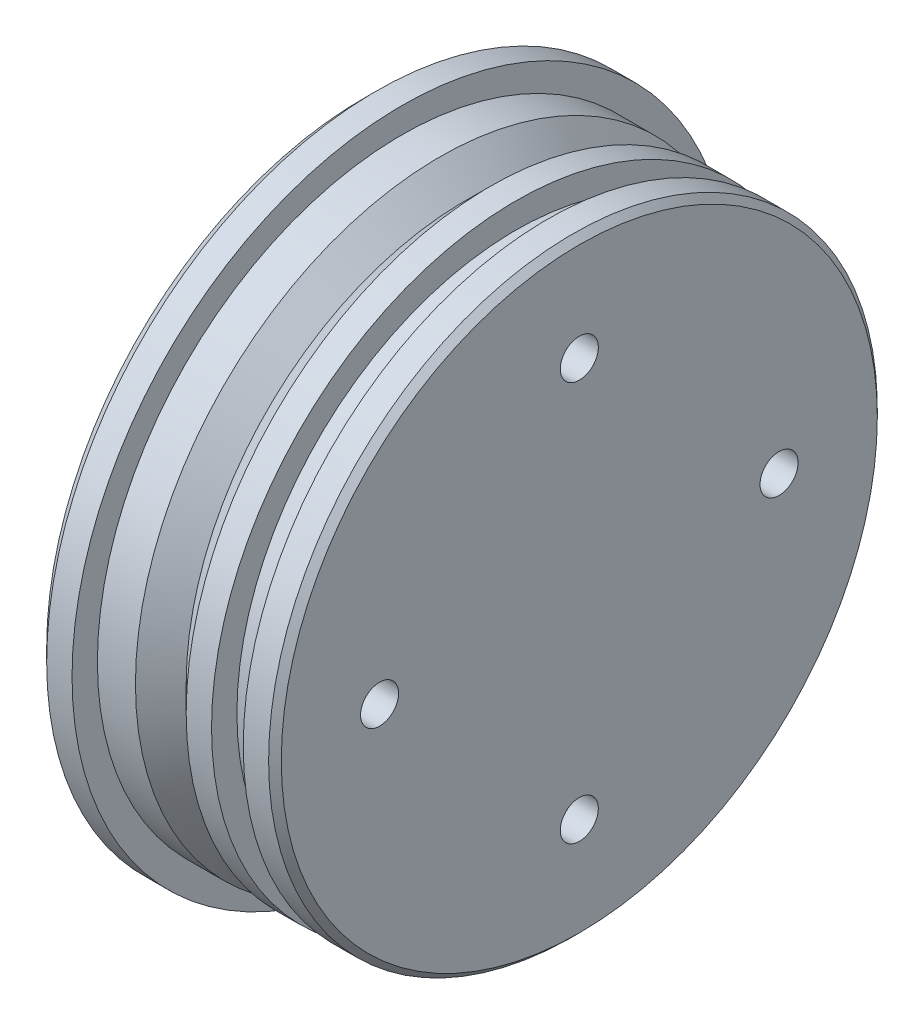
ISO-10303-21;
HEADER;
FILE_DESCRIPTION(('STEP AP214'),'2;1');
FILE_NAME('part.step','',(''),(''),'','','');
FILE_SCHEMA(('AUTOMOTIVE_DESIGN { 1 0 10303 214 1 1 1 1 }'));
ENDSEC;
DATA;
#1=APPLICATION_CONTEXT('core data for automotive mechanical design processes');
#2=APPLICATION_PROTOCOL_DEFINITION('international standard','automotive_design',2000,#1);
#3=PRODUCT_CONTEXT('',#1,'mechanical');
#4=PRODUCT('Part','Part','',(#3));
#5=PRODUCT_RELATED_PRODUCT_CATEGORY('part','',(#4));
#6=PRODUCT_DEFINITION_FORMATION('','',#4);
#7=PRODUCT_DEFINITION_CONTEXT('part definition',#1,'design');
#8=PRODUCT_DEFINITION('design','',#6,#7);
#9=PRODUCT_DEFINITION_SHAPE('','',#8);
#10=(LENGTH_UNIT() NAMED_UNIT(*) SI_UNIT(.MILLI.,.METRE.));
#11=(NAMED_UNIT(*) PLANE_ANGLE_UNIT() SI_UNIT($,.RADIAN.));
#12=(NAMED_UNIT(*) SI_UNIT($,.STERADIAN.) SOLID_ANGLE_UNIT());
#13=UNCERTAINTY_MEASURE_WITH_UNIT(LENGTH_MEASURE(1.E-05),#10,'distance_accuracy_value','');
#14=(GEOMETRIC_REPRESENTATION_CONTEXT(3) GLOBAL_UNCERTAINTY_ASSIGNED_CONTEXT((#13)) GLOBAL_UNIT_ASSIGNED_CONTEXT((#10,
#11,#12)) REPRESENTATION_CONTEXT('',''));
#15=CARTESIAN_POINT('',(0.,0.,0.));
#16=DIRECTION('',(0.,0.,1.));
#17=DIRECTION('',(1.,0.,0.));
#18=AXIS2_PLACEMENT_3D('',#15,#16,#17);
#19=CARTESIAN_POINT('',(-17.,0.,0.));
#20=DIRECTION('',(1.,0.,0.));
#21=DIRECTION('',(0.,0.,-1.));
#22=AXIS2_PLACEMENT_3D('',#19,#20,#21);
#23=PLANE('',#22);
#24=CARTESIAN_POINT('',(-17.,0.,0.));
#25=DIRECTION('',(-1.,0.,0.));
#26=DIRECTION('',(0.,0.,1.));
#27=AXIS2_PLACEMENT_3D('',#24,#25,#26);
#28=CIRCLE('',#27,25.);
#29=CARTESIAN_POINT('',(-17.,0.,25.));
#30=VERTEX_POINT('',#29);
#31=EDGE_CURVE('E10',#30,#30,#28,.T.);
#32=ORIENTED_EDGE('',*,*,#31,.T.);
#33=EDGE_LOOP('',(#32));
#34=FACE_BOUND('',#33,.T.);
#35=ADVANCED_FACE('F35',(#34),#23,.F.);
#36=CARTESIAN_POINT('',(-16.,0.,0.));
#37=DIRECTION('',(1.,0.,0.));
#38=DIRECTION('',(0.,0.,-1.));
#39=AXIS2_PLACEMENT_3D('',#36,#37,#38);
#40=CONICAL_SURFACE('',#39,26.,0.78539816339745);
#41=ORIENTED_EDGE('',*,*,#31,.F.);
#42=EDGE_LOOP('',(#41));
#43=FACE_BOUND('',#42,.T.);
#44=CARTESIAN_POINT('',(-16.,0.,0.));
#45=DIRECTION('',(-1.,0.,0.));
#46=DIRECTION('',(0.,0.,1.));
#47=AXIS2_PLACEMENT_3D('',#44,#45,#46);
#48=CIRCLE('',#47,26.);
#49=CARTESIAN_POINT('',(-16.,0.,26.));
#50=VERTEX_POINT('',#49);
#51=EDGE_CURVE('E41',#50,#50,#48,.T.);
#52=ORIENTED_EDGE('',*,*,#51,.T.);
#53=EDGE_LOOP('',(#52));
#54=FACE_BOUND('',#53,.T.);
#55=ADVANCED_FACE('F141',(#43,#54),#40,.T.);
#56=CARTESIAN_POINT('',(0.,0.,0.));
#57=DIRECTION('',(-1.,0.,0.));
#58=DIRECTION('',(0.,0.,1.));
#59=AXIS2_PLACEMENT_3D('',#56,#57,#58);
#60=CYLINDRICAL_SURFACE('',#59,26.);
#61=ORIENTED_EDGE('',*,*,#51,.F.);
#62=EDGE_LOOP('',(#61));
#63=FACE_BOUND('',#62,.T.);
#64=CARTESIAN_POINT('',(-14.,0.,0.));
#65=DIRECTION('',(-1.,0.,0.));
#66=DIRECTION('',(0.,0.,1.));
#67=AXIS2_PLACEMENT_3D('',#64,#65,#66);
#68=CIRCLE('',#67,26.);
#69=CARTESIAN_POINT('',(-14.,0.,26.));
#70=VERTEX_POINT('',#69);
#71=EDGE_CURVE('E45',#70,#70,#68,.T.);
#72=ORIENTED_EDGE('',*,*,#71,.T.);
#73=EDGE_LOOP('',(#72));
#74=FACE_BOUND('',#73,.T.);
#75=ADVANCED_FACE('F145',(#63,#74),#60,.T.);
#76=CARTESIAN_POINT('',(-14.,26.,0.));
#77=DIRECTION('',(-1.,0.,0.));
#78=DIRECTION('',(0.,0.,1.));
#79=AXIS2_PLACEMENT_3D('',#76,#77,#78);
#80=PLANE('',#79);
#81=ORIENTED_EDGE('',*,*,#71,.F.);
#82=EDGE_LOOP('',(#81));
#83=FACE_BOUND('',#82,.T.);
#84=CARTESIAN_POINT('',(-14.,0.,0.));
#85=DIRECTION('',(-1.,0.,0.));
#86=DIRECTION('',(0.,0.,1.));
#87=AXIS2_PLACEMENT_3D('',#84,#85,#86);
#88=CIRCLE('',#87,24.);
#89=CARTESIAN_POINT('',(-14.,0.,24.));
#90=VERTEX_POINT('',#89);
#91=EDGE_CURVE('E49',#90,#90,#88,.T.);
#92=ORIENTED_EDGE('',*,*,#91,.T.);
#93=EDGE_LOOP('',(#92));
#94=FACE_BOUND('',#93,.T.);
#95=ADVANCED_FACE('F150',(#83,#94),#80,.F.);
#96=CARTESIAN_POINT('',(0.,0.,0.));
#97=DIRECTION('',(-1.,0.,0.));
#98=DIRECTION('',(0.,0.,1.));
#99=AXIS2_PLACEMENT_3D('',#96,#97,#98);
#100=CYLINDRICAL_SURFACE('',#99,24.);
#101=ORIENTED_EDGE('',*,*,#91,.F.);
#102=EDGE_LOOP('',(#101));
#103=FACE_BOUND('',#102,.T.);
#104=CARTESIAN_POINT('',(-11.,0.,0.));
#105=DIRECTION('',(-1.,0.,0.));
#106=DIRECTION('',(0.,0.,1.));
#107=AXIS2_PLACEMENT_3D('',#104,#105,#106);
#108=CIRCLE('',#107,24.);
#109=CARTESIAN_POINT('',(-11.,0.,24.));
#110=VERTEX_POINT('',#109);
#111=EDGE_CURVE('E54',#110,#110,#108,.T.);
#112=ORIENTED_EDGE('',*,*,#111,.T.);
#113=EDGE_LOOP('',(#112));
#114=FACE_BOUND('',#113,.T.);
#115=ADVANCED_FACE('F156',(#103,#114),#100,.T.);
#116=CARTESIAN_POINT('',(-9.00000000000002,0.,0.));
#117=DIRECTION('',(-1.,0.,0.));
#118=DIRECTION('',(0.,0.,1.));
#119=AXIS2_PLACEMENT_3D('',#116,#117,#118);
#120=CONICAL_SURFACE('',#119,22.,0.785398163397451);
#121=ORIENTED_EDGE('',*,*,#111,.F.);
#122=EDGE_LOOP('',(#121));
#123=FACE_BOUND('',#122,.T.);
#124=CARTESIAN_POINT('',(-9.00000000000002,0.,0.));
#125=DIRECTION('',(-1.,0.,0.));
#126=DIRECTION('',(0.,0.,1.));
#127=AXIS2_PLACEMENT_3D('',#124,#125,#126);
#128=CIRCLE('',#127,22.);
#129=CARTESIAN_POINT('',(-9.00000000000002,0.,22.));
#130=VERTEX_POINT('',#129);
#131=EDGE_CURVE('E57',#130,#130,#128,.T.);
#132=ORIENTED_EDGE('',*,*,#131,.T.);
#133=EDGE_LOOP('',(#132));
#134=FACE_BOUND('',#133,.T.);
#135=ADVANCED_FACE('F160',(#123,#134),#120,.T.);
#136=CARTESIAN_POINT('',(-7.00000000000001,0.,0.));
#137=DIRECTION('',(1.,0.,0.));
#138=DIRECTION('',(0.,0.,-1.));
#139=AXIS2_PLACEMENT_3D('',#136,#137,#138);
#140=CONICAL_SURFACE('',#139,24.,0.785398163397445);
#141=ORIENTED_EDGE('',*,*,#131,.F.);
#142=EDGE_LOOP('',(#141));
#143=FACE_BOUND('',#142,.T.);
#144=CARTESIAN_POINT('',(-7.00000000000001,0.,0.));
#145=DIRECTION('',(-1.,0.,0.));
#146=DIRECTION('',(0.,0.,1.));
#147=AXIS2_PLACEMENT_3D('',#144,#145,#146);
#148=CIRCLE('',#147,24.);
#149=CARTESIAN_POINT('',(-7.00000000000001,0.,24.));
#150=VERTEX_POINT('',#149);
#151=EDGE_CURVE('E60',#150,#150,#148,.T.);
#152=ORIENTED_EDGE('',*,*,#151,.T.);
#153=EDGE_LOOP('',(#152));
#154=FACE_BOUND('',#153,.T.);
#155=ADVANCED_FACE('F164',(#143,#154),#140,.T.);
#156=CARTESIAN_POINT('',(0.,0.,0.));
#157=DIRECTION('',(-1.,0.,0.));
#158=DIRECTION('',(0.,0.,1.));
#159=AXIS2_PLACEMENT_3D('',#156,#157,#158);
#160=CYLINDRICAL_SURFACE('',#159,24.);
#161=ORIENTED_EDGE('',*,*,#151,.F.);
#162=EDGE_LOOP('',(#161));
#163=FACE_BOUND('',#162,.T.);
#164=CARTESIAN_POINT('',(-5.00000000000001,0.,0.));
#165=DIRECTION('',(-1.,0.,0.));
#166=DIRECTION('',(0.,0.,1.));
#167=AXIS2_PLACEMENT_3D('',#164,#165,#166);
#168=CIRCLE('',#167,24.);
#169=CARTESIAN_POINT('',(-5.00000000000001,0.,24.));
#170=VERTEX_POINT('',#169);
#171=EDGE_CURVE('E63',#170,#170,#168,.T.);
#172=ORIENTED_EDGE('',*,*,#171,.T.);
#173=EDGE_LOOP('',(#172));
#174=FACE_BOUND('',#173,.T.);
#175=ADVANCED_FACE('F168',(#163,#174),#160,.T.);
#176=CARTESIAN_POINT('',(-5.00000000000001,24.,0.));
#177=DIRECTION('',(-1.,0.,0.));
#178=DIRECTION('',(0.,0.,1.));
#179=AXIS2_PLACEMENT_3D('',#176,#177,#178);
#180=PLANE('',#179);
#181=ORIENTED_EDGE('',*,*,#171,.F.);
#182=EDGE_LOOP('',(#181));
#183=FACE_BOUND('',#182,.T.);
#184=CARTESIAN_POINT('',(-5.00000000000001,0.,0.));
#185=DIRECTION('',(-1.,0.,0.));
#186=DIRECTION('',(0.,0.,1.));
#187=AXIS2_PLACEMENT_3D('',#184,#185,#186);
#188=CIRCLE('',#187,22.);
#189=CARTESIAN_POINT('',(-5.00000000000001,0.,22.));
#190=VERTEX_POINT('',#189);
#191=EDGE_CURVE('E66',#190,#190,#188,.T.);
#192=ORIENTED_EDGE('',*,*,#191,.T.);
#193=EDGE_LOOP('',(#192));
#194=FACE_BOUND('',#193,.T.);
#195=ADVANCED_FACE('F172',(#183,#194),#180,.F.);
#196=CARTESIAN_POINT('',(0.,0.,0.));
#197=DIRECTION('',(-1.,0.,0.));
#198=DIRECTION('',(0.,0.,1.));
#199=AXIS2_PLACEMENT_3D('',#196,#197,#198);
#200=CYLINDRICAL_SURFACE('',#199,22.);
#201=ORIENTED_EDGE('',*,*,#191,.F.);
#202=EDGE_LOOP('',(#201));
#203=FACE_BOUND('',#202,.T.);
#204=CARTESIAN_POINT('',(-2.50000000000001,0.,0.));
#205=DIRECTION('',(-1.,0.,0.));
#206=DIRECTION('',(0.,0.,1.));
#207=AXIS2_PLACEMENT_3D('',#204,#205,#206);
#208=CIRCLE('',#207,22.);
#209=CARTESIAN_POINT('',(-2.50000000000001,0.,22.));
#210=VERTEX_POINT('',#209);
#211=EDGE_CURVE('E69',#210,#210,#208,.T.);
#212=ORIENTED_EDGE('',*,*,#211,.T.);
#213=EDGE_LOOP('',(#212));
#214=FACE_BOUND('',#213,.T.);
#215=ADVANCED_FACE('F176',(#203,#214),#200,.T.);
#216=CARTESIAN_POINT('',(-2.50000000000001,22.,0.));
#217=DIRECTION('',(1.,0.,0.));
#218=DIRECTION('',(0.,0.,-1.));
#219=AXIS2_PLACEMENT_3D('',#216,#217,#218);
#220=PLANE('',#219);
#221=ORIENTED_EDGE('',*,*,#211,.F.);
#222=EDGE_LOOP('',(#221));
#223=FACE_BOUND('',#222,.T.);
#224=CARTESIAN_POINT('',(-2.50000000000001,0.,0.));
#225=DIRECTION('',(-1.,0.,0.));
#226=DIRECTION('',(0.,0.,1.));
#227=AXIS2_PLACEMENT_3D('',#224,#225,#226);
#228=CIRCLE('',#227,24.);
#229=CARTESIAN_POINT('',(-2.50000000000001,0.,24.));
#230=VERTEX_POINT('',#229);
#231=EDGE_CURVE('E72',#230,#230,#228,.T.);
#232=ORIENTED_EDGE('',*,*,#231,.T.);
#233=EDGE_LOOP('',(#232));
#234=FACE_BOUND('',#233,.T.);
#235=ADVANCED_FACE('F136',(#223,#234),#220,.F.);
#236=CARTESIAN_POINT('',(0.,0.,0.));
#237=DIRECTION('',(-1.,0.,0.));
#238=DIRECTION('',(0.,0.,1.));
#239=AXIS2_PLACEMENT_3D('',#236,#237,#238);
#240=CYLINDRICAL_SURFACE('',#239,24.);
#241=ORIENTED_EDGE('',*,*,#231,.F.);
#242=EDGE_LOOP('',(#241));
#243=FACE_BOUND('',#242,.T.);
#244=CARTESIAN_POINT('',(-0.500000000000003,0.,0.));
#245=DIRECTION('',(-1.,0.,0.));
#246=DIRECTION('',(0.,0.,1.));
#247=AXIS2_PLACEMENT_3D('',#244,#245,#246);
#248=CIRCLE('',#247,24.);
#249=CARTESIAN_POINT('',(-0.500000000000003,0.,24.));
#250=VERTEX_POINT('',#249);
#251=EDGE_CURVE('E75',#250,#250,#248,.T.);
#252=ORIENTED_EDGE('',*,*,#251,.T.);
#253=EDGE_LOOP('',(#252));
#254=FACE_BOUND('',#253,.T.);
#255=ADVANCED_FACE('F130',(#243,#254),#240,.T.);
#256=CARTESIAN_POINT('',(0.,0.,0.));
#257=DIRECTION('',(-1.,0.,0.));
#258=DIRECTION('',(0.,0.,1.));
#259=AXIS2_PLACEMENT_3D('',#256,#257,#258);
#260=CONICAL_SURFACE('',#259,23.5,0.785398163397446);
#261=ORIENTED_EDGE('',*,*,#251,.F.);
#262=EDGE_LOOP('',(#261));
#263=FACE_BOUND('',#262,.T.);
#264=CARTESIAN_POINT('',(0.,0.,0.));
#265=DIRECTION('',(-1.,0.,0.));
#266=DIRECTION('',(0.,0.,1.));
#267=AXIS2_PLACEMENT_3D('',#264,#265,#266);
#268=CIRCLE('',#267,23.5);
#269=CARTESIAN_POINT('',(0.,0.,23.5));
#270=VERTEX_POINT('',#269);
#271=EDGE_CURVE('E78',#270,#270,#268,.T.);
#272=ORIENTED_EDGE('',*,*,#271,.T.);
#273=EDGE_LOOP('',(#272));
#274=FACE_BOUND('',#273,.T.);
#275=ADVANCED_FACE('F119',(#263,#274),#260,.T.);
#276=CARTESIAN_POINT('',(0.,23.5,0.));
#277=DIRECTION('',(-1.,0.,0.));
#278=DIRECTION('',(0.,0.,1.));
#279=AXIS2_PLACEMENT_3D('',#276,#277,#278);
#280=PLANE('',#279);
#281=CARTESIAN_POINT('',(0.,15.75,-2.78423117894278E-13));
#282=DIRECTION('',(1.,0.,0.));
#283=DIRECTION('',(0.,0.,-1.));
#284=AXIS2_PLACEMENT_3D('',#281,#282,#283);
#285=CIRCLE('',#284,1.5);
#286=CARTESIAN_POINT('',(0.,15.75,-1.50000000000028));
#287=VERTEX_POINT('',#286);
#288=EDGE_CURVE('E100',#287,#287,#285,.T.);
#289=ORIENTED_EDGE('',*,*,#288,.F.);
#290=EDGE_LOOP('',(#289));
#291=FACE_BOUND('',#290,.T.);
#292=CARTESIAN_POINT('',(0.,-1.10154940724527E-13,-15.75));
#293=DIRECTION('',(1.,0.,0.));
#294=DIRECTION('',(0.,0.,-1.));
#295=AXIS2_PLACEMENT_3D('',#292,#293,#294);
#296=CIRCLE('',#295,1.5);
#297=CARTESIAN_POINT('',(0.,-1.10154940724527E-13,-17.25));
#298=VERTEX_POINT('',#297);
#299=EDGE_CURVE('E97',#298,#298,#296,.T.);
#300=ORIENTED_EDGE('',*,*,#299,.F.);
#301=EDGE_LOOP('',(#300));
#302=FACE_BOUND('',#301,.T.);
#303=CARTESIAN_POINT('',(0.,0.,15.75));
#304=DIRECTION('',(1.,0.,0.));
#305=DIRECTION('',(0.,0.,-1.));
#306=AXIS2_PLACEMENT_3D('',#303,#304,#305);
#307=CIRCLE('',#306,1.5);
#308=CARTESIAN_POINT('',(0.,0.,14.25));
#309=VERTEX_POINT('',#308);
#310=EDGE_CURVE('E91',#309,#309,#307,.T.);
#311=ORIENTED_EDGE('',*,*,#310,.F.);
#312=EDGE_LOOP('',(#311));
#313=FACE_BOUND('',#312,.T.);
#314=CARTESIAN_POINT('',(0.,-15.75,1.63043674551681E-13));
#315=DIRECTION('',(1.,0.,0.));
#316=DIRECTION('',(0.,0.,-1.));
#317=AXIS2_PLACEMENT_3D('',#314,#315,#316);
#318=CIRCLE('',#317,1.5);
#319=CARTESIAN_POINT('',(0.,-15.75,-1.49999999999983));
#320=VERTEX_POINT('',#319);
#321=EDGE_CURVE('E85',#320,#320,#318,.T.);
#322=ORIENTED_EDGE('',*,*,#321,.F.);
#323=EDGE_LOOP('',(#322));
#324=FACE_BOUND('',#323,.T.);
#325=ORIENTED_EDGE('',*,*,#271,.F.);
#326=EDGE_LOOP('',(#325));
#327=FACE_BOUND('',#326,.T.);
#328=ADVANCED_FACE('F115',(#291,#302,#313,#324,#327),#280,.F.);
#329=CARTESIAN_POINT('',(-10.,-15.75,1.63043674551681E-13));
#330=DIRECTION('',(1.,0.,0.));
#331=DIRECTION('',(0.,0.,-1.));
#332=AXIS2_PLACEMENT_3D('',#329,#330,#331);
#333=CYLINDRICAL_SURFACE('',#332,1.5);
#334=CARTESIAN_POINT('',(-10.,-15.75,1.63043674551681E-13));
#335=DIRECTION('',(1.,0.,0.));
#336=DIRECTION('',(0.,0.,-1.));
#337=AXIS2_PLACEMENT_3D('',#334,#335,#336);
#338=CIRCLE('',#337,1.5);
#339=CARTESIAN_POINT('',(-10.,-15.75,-1.49999999999983));
#340=VERTEX_POINT('',#339);
#341=EDGE_CURVE('E82',#340,#340,#338,.T.);
#342=ORIENTED_EDGE('',*,*,#341,.F.);
#343=EDGE_LOOP('',(#342));
#344=FACE_BOUND('',#343,.T.);
#345=ORIENTED_EDGE('',*,*,#321,.T.);
#346=EDGE_LOOP('',(#345));
#347=FACE_BOUND('',#346,.T.);
#348=ADVANCED_FACE('F118',(#344,#347),#333,.F.);
#349=CARTESIAN_POINT('',(-10.,-15.75,1.63043674551681E-13));
#350=DIRECTION('',(1.,0.,0.));
#351=DIRECTION('',(0.,0.,-1.));
#352=AXIS2_PLACEMENT_3D('',#349,#350,#351);
#353=PLANE('',#352);
#354=ORIENTED_EDGE('',*,*,#341,.T.);
#355=EDGE_LOOP('',(#354));
#356=FACE_BOUND('',#355,.T.);
#357=ADVANCED_FACE('F215',(#356),#353,.T.);
#358=CARTESIAN_POINT('',(-10.,0.,15.75));
#359=DIRECTION('',(1.,0.,0.));
#360=DIRECTION('',(0.,0.,-1.));
#361=AXIS2_PLACEMENT_3D('',#358,#359,#360);
#362=CYLINDRICAL_SURFACE('',#361,1.5);
#363=CARTESIAN_POINT('',(-10.,0.,15.75));
#364=DIRECTION('',(1.,0.,0.));
#365=DIRECTION('',(0.,0.,-1.));
#366=AXIS2_PLACEMENT_3D('',#363,#364,#365);
#367=CIRCLE('',#366,1.5);
#368=CARTESIAN_POINT('',(-10.,0.,14.25));
#369=VERTEX_POINT('',#368);
#370=EDGE_CURVE('E88',#369,#369,#367,.T.);
#371=ORIENTED_EDGE('',*,*,#370,.F.);
#372=EDGE_LOOP('',(#371));
#373=FACE_BOUND('',#372,.T.);
#374=ORIENTED_EDGE('',*,*,#310,.T.);
#375=EDGE_LOOP('',(#374));
#376=FACE_BOUND('',#375,.T.);
#377=ADVANCED_FACE('F225',(#373,#376),#362,.F.);
#378=CARTESIAN_POINT('',(-10.,0.,15.75));
#379=DIRECTION('',(1.,0.,0.));
#380=DIRECTION('',(0.,0.,-1.));
#381=AXIS2_PLACEMENT_3D('',#378,#379,#380);
#382=PLANE('',#381);
#383=ORIENTED_EDGE('',*,*,#370,.T.);
#384=EDGE_LOOP('',(#383));
#385=FACE_BOUND('',#384,.T.);
#386=ADVANCED_FACE('F235',(#385),#382,.T.);
#387=CARTESIAN_POINT('',(-10.,-1.10154940724527E-13,-15.75));
#388=DIRECTION('',(1.,0.,0.));
#389=DIRECTION('',(0.,0.,-1.));
#390=AXIS2_PLACEMENT_3D('',#387,#388,#389);
#391=CYLINDRICAL_SURFACE('',#390,1.5);
#392=CARTESIAN_POINT('',(-10.,-1.10154940724527E-13,-15.75));
#393=DIRECTION('',(1.,0.,0.));
#394=DIRECTION('',(0.,0.,-1.));
#395=AXIS2_PLACEMENT_3D('',#392,#393,#394);
#396=CIRCLE('',#395,1.5);
#397=CARTESIAN_POINT('',(-10.,-1.10154940724527E-13,-17.25));
#398=VERTEX_POINT('',#397);
#399=EDGE_CURVE('E94',#398,#398,#396,.T.);
#400=ORIENTED_EDGE('',*,*,#399,.F.);
#401=EDGE_LOOP('',(#400));
#402=FACE_BOUND('',#401,.T.);
#403=ORIENTED_EDGE('',*,*,#299,.T.);
#404=EDGE_LOOP('',(#403));
#405=FACE_BOUND('',#404,.T.);
#406=ADVANCED_FACE('F245',(#402,#405),#391,.F.);
#407=CARTESIAN_POINT('',(-10.,0.,0.));
#408=DIRECTION('',(1.,0.,0.));
#409=DIRECTION('',(0.,0.,-1.));
#410=AXIS2_PLACEMENT_3D('',#407,#408,#409);
#411=PLANE('',#410);
#412=ORIENTED_EDGE('',*,*,#399,.T.);
#413=EDGE_LOOP('',(#412));
#414=FACE_BOUND('',#413,.T.);
#415=ADVANCED_FACE('F111',(#414),#411,.T.);
#416=CARTESIAN_POINT('',(-10.,15.75,-2.78423117894278E-13));
#417=DIRECTION('',(1.,0.,0.));
#418=DIRECTION('',(0.,0.,-1.));
#419=AXIS2_PLACEMENT_3D('',#416,#417,#418);
#420=CYLINDRICAL_SURFACE('',#419,1.5);
#421=CARTESIAN_POINT('',(-10.,15.75,-2.78423117894278E-13));
#422=DIRECTION('',(1.,0.,0.));
#423=DIRECTION('',(0.,0.,-1.));
#424=AXIS2_PLACEMENT_3D('',#421,#422,#423);
#425=CIRCLE('',#424,1.5);
#426=CARTESIAN_POINT('',(-10.,15.75,-1.50000000000028));
#427=VERTEX_POINT('',#426);
#428=EDGE_CURVE('E81',#427,#427,#425,.T.);
#429=ORIENTED_EDGE('',*,*,#428,.F.);
#430=EDGE_LOOP('',(#429));
#431=FACE_BOUND('',#430,.T.);
#432=ORIENTED_EDGE('',*,*,#288,.T.);
#433=EDGE_LOOP('',(#432));
#434=FACE_BOUND('',#433,.T.);
#435=ADVANCED_FACE('F108',(#431,#434),#420,.F.);
#436=CARTESIAN_POINT('',(-10.,0.,0.));
#437=DIRECTION('',(1.,0.,0.));
#438=DIRECTION('',(0.,0.,-1.));
#439=AXIS2_PLACEMENT_3D('',#436,#437,#438);
#440=PLANE('',#439);
#441=ORIENTED_EDGE('',*,*,#428,.T.);
#442=EDGE_LOOP('',(#441));
#443=FACE_BOUND('',#442,.T.);
#444=ADVANCED_FACE('F106',(#443),#440,.T.);
#445=CLOSED_SHELL('',(#35,#55,#75,#95,#115,#135,#155,#175,#195,#215,#235,#255,#275,#328,#348,
#357,#377,#386,#406,#415,#435,#444));
#446=MANIFOLD_SOLID_BREP('B2',#445);
#447=ADVANCED_BREP_SHAPE_REPRESENTATION('',(#18,#446),#14);
#448=SHAPE_DEFINITION_REPRESENTATION(#9,#447);
ENDSEC;
END-ISO-10303-21;
